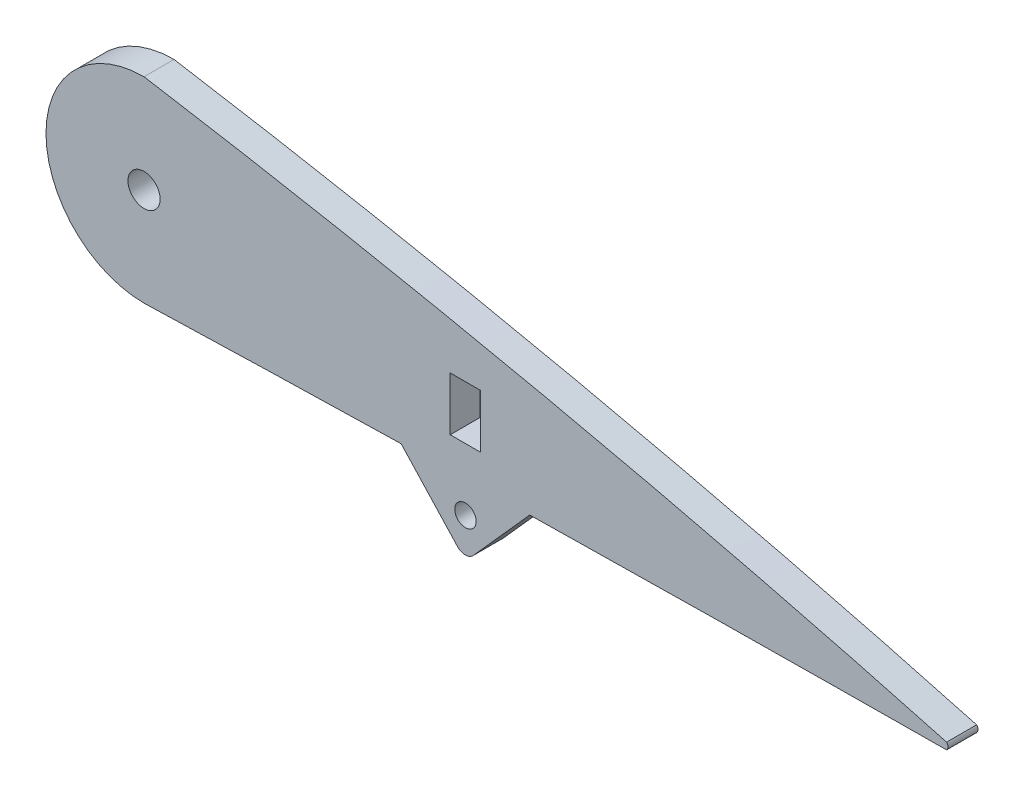
ISO-10303-21;
HEADER;
FILE_DESCRIPTION(('STEP AP214'),'2;1');
FILE_NAME('part.step','',(''),(''),'','','');
FILE_SCHEMA(('AUTOMOTIVE_DESIGN { 1 0 10303 214 1 1 1 1 }'));
ENDSEC;
DATA;
#1=APPLICATION_CONTEXT('core data for automotive mechanical design processes');
#2=APPLICATION_PROTOCOL_DEFINITION('international standard','automotive_design',2000,#1);
#3=PRODUCT_CONTEXT('',#1,'mechanical');
#4=PRODUCT('Part','Part','',(#3));
#5=PRODUCT_RELATED_PRODUCT_CATEGORY('part','',(#4));
#6=PRODUCT_DEFINITION_FORMATION('','',#4);
#7=PRODUCT_DEFINITION_CONTEXT('part definition',#1,'design');
#8=PRODUCT_DEFINITION('design','',#6,#7);
#9=PRODUCT_DEFINITION_SHAPE('','',#8);
#10=(LENGTH_UNIT() NAMED_UNIT(*) SI_UNIT(.MILLI.,.METRE.));
#11=(NAMED_UNIT(*) PLANE_ANGLE_UNIT() SI_UNIT($,.RADIAN.));
#12=(NAMED_UNIT(*) SI_UNIT($,.STERADIAN.) SOLID_ANGLE_UNIT());
#13=UNCERTAINTY_MEASURE_WITH_UNIT(LENGTH_MEASURE(1.E-05),#10,'distance_accuracy_value','');
#14=(GEOMETRIC_REPRESENTATION_CONTEXT(3) GLOBAL_UNCERTAINTY_ASSIGNED_CONTEXT((#13)) GLOBAL_UNIT_ASSIGNED_CONTEXT((#10,
#11,#12)) REPRESENTATION_CONTEXT('',''));
#15=CARTESIAN_POINT('',(0.,0.,0.));
#16=DIRECTION('',(0.,0.,1.));
#17=DIRECTION('',(1.,0.,0.));
#18=AXIS2_PLACEMENT_3D('',#15,#16,#17);
#19=CARTESIAN_POINT('',(117.917146209674,-105.209522207266,1.4));
#20=DIRECTION('',(-0.746169134705342,0.665756428743337,0.));
#21=DIRECTION('',(-0.665756428743337,-0.746169134705342,0.));
#22=AXIS2_PLACEMENT_3D('',#19,#20,#21);
#23=PLANE('',#22);
#24=DIRECTION('',(0.665756428743337,0.746169134705342,0.));
#25=VECTOR('',#24,1.);
#26=CARTESIAN_POINT('',(117.917146209674,-105.209522207266,-1.4));
#27=LINE('',#26,#25);
#28=CARTESIAN_POINT('',(205.824005664754,-6.68492308612301,-1.4));
#29=VERTEX_POINT('',#28);
#30=CARTESIAN_POINT('',(211.091334090503,-0.781385810383423,-1.4));
#31=VERTEX_POINT('',#30);
#32=EDGE_CURVE('E197',#29,#31,#27,.T.);
#33=ORIENTED_EDGE('',*,*,#32,.T.);
#34=DIRECTION('',(0.,0.,-1.));
#35=VECTOR('',#34,1.);
#36=CARTESIAN_POINT('',(211.091334090503,-0.781385810383423,1.4));
#37=LINE('',#36,#35);
#38=CARTESIAN_POINT('',(211.091334090503,-0.781385810383423,1.4));
#39=VERTEX_POINT('',#38);
#40=EDGE_CURVE('E11',#39,#31,#37,.T.);
#41=ORIENTED_EDGE('',*,*,#40,.F.);
#42=DIRECTION('',(0.665756428743337,0.746169134705342,0.));
#43=VECTOR('',#42,1.);
#44=CARTESIAN_POINT('',(117.917146209674,-105.209522207266,1.4));
#45=LINE('',#44,#43);
#46=CARTESIAN_POINT('',(205.824005664754,-6.68492308612301,1.4));
#47=VERTEX_POINT('',#46);
#48=EDGE_CURVE('E349',#47,#39,#45,.T.);
#49=ORIENTED_EDGE('',*,*,#48,.F.);
#50=DIRECTION('',(0.,0.,-1.));
#51=VECTOR('',#50,1.);
#52=CARTESIAN_POINT('',(205.824005664754,-6.68492308612301,1.4));
#53=LINE('',#52,#51);
#54=EDGE_CURVE('E239',#47,#29,#53,.T.);
#55=ORIENTED_EDGE('',*,*,#54,.T.);
#56=EDGE_LOOP('',(#33,#41,#49,#55));
#57=FACE_BOUND('',#56,.T.);
#58=ADVANCED_FACE('F41',(#57),#23,.F.);
#59=CARTESIAN_POINT('',(211.091334090503,-0.781385810383404,1.4));
#60=CARTESIAN_POINT('',(215.029550731743,-0.710611929762395,1.4));
#61=CARTESIAN_POINT('',(221.226120503685,-0.611852577213931,1.4));
#62=CARTESIAN_POINT('',(229.61763017219,-0.502926180050159,1.4));
#63=CARTESIAN_POINT('',(236.087353853958,-0.43151419174541,1.4));
#64=CARTESIAN_POINT('',(241.980776912645,-0.37652046147154,1.4));
#65=CARTESIAN_POINT('',(246.558970010783,-0.339535885925244,1.4));
#66=CARTESIAN_POINT('',(249.120490964528,-0.321271242457111,1.4));
#67=CARTESIAN_POINT('',(250.,-0.315,1.4));
#68=B_SPLINE_CURVE_WITH_KNOTS('',3,(#59,#60,#61,#62,#63,#64,#65,#66,#67),.UNSPECIFIED.,.F.,.F.,
(4,1,1,1,1,1,4),(0.846478182076588,0.893099151655267,0.919831064622048,0.945809917390178,
0.96968060086528,0.989589706283647,1.),.UNSPECIFIED.);
#69=DIRECTION('',(0.,0.,-1.));
#70=VECTOR('',#69,1.);
#71=SURFACE_OF_LINEAR_EXTRUSION('',#68,#70);
#72=CARTESIAN_POINT('',(211.091334090503,-0.781385810383404,-1.4));
#73=CARTESIAN_POINT('',(215.029550731743,-0.710611929762395,-1.4));
#74=CARTESIAN_POINT('',(221.226120503685,-0.611852577213931,-1.4));
#75=CARTESIAN_POINT('',(229.61763017219,-0.502926180050159,-1.4));
#76=CARTESIAN_POINT('',(236.087353853958,-0.43151419174541,-1.4));
#77=CARTESIAN_POINT('',(241.980776912645,-0.37652046147154,-1.4));
#78=CARTESIAN_POINT('',(246.558970010783,-0.339535885925244,-1.4));
#79=CARTESIAN_POINT('',(249.120490964528,-0.321271242457111,-1.4));
#80=CARTESIAN_POINT('',(250.,-0.315,-1.4));
#81=B_SPLINE_CURVE_WITH_KNOTS('',3,(#72,#73,#74,#75,#76,#77,#78,#79,#80),.UNSPECIFIED.,.F.,.F.,
(4,1,1,1,1,1,4),(0.846478182076588,0.893099151655267,0.919831064622048,0.945809917390178,
0.96968060086528,0.989589706283647,1.),.UNSPECIFIED.);
#82=CARTESIAN_POINT('',(250.,-0.315,-1.4));
#83=VERTEX_POINT('',#82);
#84=EDGE_CURVE('E201',#31,#83,#81,.T.);
#85=ORIENTED_EDGE('',*,*,#84,.T.);
#86=DIRECTION('',(0.,0.,-1.));
#87=VECTOR('',#86,1.);
#88=CARTESIAN_POINT('',(250.,-0.315,1.4));
#89=LINE('',#88,#87);
#90=CARTESIAN_POINT('',(250.,-0.315,1.4));
#91=VERTEX_POINT('',#90);
#92=EDGE_CURVE('E52',#91,#83,#89,.T.);
#93=ORIENTED_EDGE('',*,*,#92,.F.);
#94=EDGE_CURVE('E351',#39,#91,#68,.T.);
#95=ORIENTED_EDGE('',*,*,#94,.F.);
#96=ORIENTED_EDGE('',*,*,#40,.T.);
#97=EDGE_LOOP('',(#85,#93,#95,#96));
#98=FACE_BOUND('',#97,.T.);
#99=ADVANCED_FACE('F292',(#98),#71,.F.);
#100=CARTESIAN_POINT('',(249.685,0.,1.4));
#101=DIRECTION('',(0.,0.,-1.));
#102=DIRECTION('',(-1.,0.,0.));
#103=AXIS2_PLACEMENT_3D('',#100,#101,#102);
#104=CYLINDRICAL_SURFACE('',#103,0.445477272147512);
#105=CARTESIAN_POINT('',(249.685,0.,-1.4));
#106=DIRECTION('',(0.,0.,1.));
#107=DIRECTION('',(1.,0.,0.));
#108=AXIS2_PLACEMENT_3D('',#105,#106,#107);
#109=CIRCLE('',#108,0.445477272147512);
#110=CARTESIAN_POINT('',(250.,0.315,-1.4));
#111=VERTEX_POINT('',#110);
#112=EDGE_CURVE('E207',#111,#83,#109,.F.);
#113=ORIENTED_EDGE('',*,*,#112,.F.);
#114=DIRECTION('',(0.,0.,-1.));
#115=VECTOR('',#114,1.);
#116=CARTESIAN_POINT('',(250.,0.315,1.4));
#117=LINE('',#116,#115);
#118=CARTESIAN_POINT('',(250.,0.315,1.4));
#119=VERTEX_POINT('',#118);
#120=EDGE_CURVE('E249',#119,#111,#117,.T.);
#121=ORIENTED_EDGE('',*,*,#120,.F.);
#122=CARTESIAN_POINT('',(249.685,0.,1.4));
#123=DIRECTION('',(0.,0.,1.));
#124=DIRECTION('',(1.,0.,0.));
#125=AXIS2_PLACEMENT_3D('',#122,#123,#124);
#126=CIRCLE('',#125,0.445477272147512);
#127=EDGE_CURVE('E337',#119,#91,#126,.F.);
#128=ORIENTED_EDGE('',*,*,#127,.T.);
#129=ORIENTED_EDGE('',*,*,#92,.T.);
#130=EDGE_LOOP('',(#113,#121,#128,#129));
#131=FACE_BOUND('',#130,.T.);
#132=ADVANCED_FACE('F298',(#131),#104,.T.);
#133=CARTESIAN_POINT('',(250.,0.315,1.4));
#134=CARTESIAN_POINT('',(249.1556677398,0.545019817836279,1.4));
#135=CARTESIAN_POINT('',(246.72017569763,1.20851624251313,1.4));
#136=CARTESIAN_POINT('',(242.39133208333,2.35833905261626,1.4));
#137=CARTESIAN_POINT('',(236.8497612043,3.78762536446423,1.4));
#138=CARTESIAN_POINT('',(230.779918279366,5.29800883725429,1.4));
#139=CARTESIAN_POINT('',(224.455917947462,6.81286602762795,1.4));
#140=CARTESIAN_POINT('',(218.030543495663,8.2916106324586,1.4));
#141=CARTESIAN_POINT('',(211.562405044606,9.71973505661334,1.4));
#142=CARTESIAN_POINT('',(205.072411508973,11.0923749324442,1.4));
#143=CARTESIAN_POINT('',(198.567970912658,12.4078507263971,1.4));
#144=CARTESIAN_POINT('',(192.05236991352,13.6652979238497,1.4));
#145=CARTESIAN_POINT('',(185.527619972818,14.8640933031022,1.4));
#146=CARTESIAN_POINT('',(178.995338991115,16.0034047787228,1.4));
#147=CARTESIAN_POINT('',(172.457064741278,17.0823881152075,1.4));
#148=CARTESIAN_POINT('',(165.914317094847,18.0998278411168,1.4));
#149=CARTESIAN_POINT('',(159.368680729007,19.0545018148018,1.4));
#150=CARTESIAN_POINT('',(152.821805127969,19.9448856028229,1.4));
#151=CARTESIAN_POINT('',(146.275439401362,20.76928218283,1.4));
#152=CARTESIAN_POINT('',(139.731359791294,21.5256761133202,1.4));
#153=CARTESIAN_POINT('',(133.191836730309,22.2120042488889,1.4));
#154=CARTESIAN_POINT('',(126.658683026114,22.8257214286805,1.4));
#155=CARTESIAN_POINT('',(120.136770918309,23.363973266088,1.4));
#156=CARTESIAN_POINT('',(113.628567140501,23.8246773240715,1.4));
#157=CARTESIAN_POINT('',(107.152732037453,24.2002425936989,1.4));
#158=CARTESIAN_POINT('',(100.741095692949,24.4983995100481,1.4));
#159=CARTESIAN_POINT('',(94.4117527148801,24.6866497684384,1.4));
#160=CARTESIAN_POINT('',(88.1559179929208,24.7400956502598,1.4));
#161=CARTESIAN_POINT('',(81.9490430552625,24.658849143563,1.4));
#162=CARTESIAN_POINT('',(75.7805205915729,24.4410138083138,1.4));
#163=CARTESIAN_POINT('',(69.653692942001,24.0818848206021,1.4));
#164=CARTESIAN_POINT('',(63.5754105017725,23.5780063609574,1.4));
#165=CARTESIAN_POINT('',(57.5551895509689,22.9249466580897,1.4));
#166=CARTESIAN_POINT('',(51.6057626883655,22.1190655216041,1.4));
#167=CARTESIAN_POINT('',(45.7444003114454,21.1565644320825,1.4));
#168=CARTESIAN_POINT('',(39.9958575941734,20.035371389506,1.4));
#169=CARTESIAN_POINT('',(34.397919842374,18.756316234168,1.4));
#170=CARTESIAN_POINT('',(29.0103821035244,17.327615607561,1.4));
#171=CARTESIAN_POINT('',(23.9257984082512,15.7718649214876,1.4));
#172=CARTESIAN_POINT('',(19.2706788398757,14.1342694339559,1.4));
#173=CARTESIAN_POINT('',(15.1790983912921,12.4833354375465,1.4));
#174=CARTESIAN_POINT('',(11.7404757900967,10.8956109948061,1.4));
#175=CARTESIAN_POINT('',(8.95937186897629,9.42957736532332,1.4));
#176=CARTESIAN_POINT('',(6.76089118010329,8.10860319940964,1.4));
#177=CARTESIAN_POINT('',(5.03370974806799,6.92463805475642,1.4));
#178=CARTESIAN_POINT('',(3.67169493343308,5.85422966432144,1.4));
#179=CARTESIAN_POINT('',(2.59210112319415,4.87130536863603,1.4));
#180=CARTESIAN_POINT('',(1.73817566850273,3.95259574329487,1.4));
#181=CARTESIAN_POINT('',(1.06987082981603,3.08094637334676,1.4));
#182=CARTESIAN_POINT('',(0.571645410381898,2.24162210227498,1.4));
#183=CARTESIAN_POINT('',(0.215773898828885,1.43078539700941,1.4));
#184=CARTESIAN_POINT('',(0.102255581551055,0.88324169451159,1.4));
#185=CARTESIAN_POINT('',(0.047975,0.621425,1.4));
#186=B_SPLINE_CURVE_WITH_KNOTS('',3,(#133,#134,#135,#136,#137,#138,#139,#140,#141,#142,#143,
#144,#145,#146,#147,#148,#149,#150,#151,#152,#153,#154,#155,#156,#157,#158,#159,#160,#161,#162,
#163,#164,#165,#166,#167,#168,#169,#170,#171,#172,#173,#174,#175,#176,#177,#178,#179,#180,#181,
#182,#183,#184,#185),.UNSPECIFIED.,.F.,.F.,(4,1,1,1,1,1,1,1,1,1,1,1,1,1,1,1,1,1,1,1,1,1,1,1,1,1,
1,1,1,1,1,1,1,1,1,1,1,1,1,1,1,1,1,1,1,1,1,1,1,1,4),(0.,0.0101621996718152,0.029313053164405,
0.0520116049167946,0.0766194676467142,0.101948061207292,0.127526131749972,0.153184130655642,
0.178867887696566,0.204557902716051,0.230245711588722,0.255925967287604,0.281594302232909,
0.307246419826604,0.332878041533464,0.358484538095463,0.384061185999046,0.409602822472883,
0.435103874040524,0.460559416336008,0.485959195382529,0.511303069995141,0.53655151535457,
0.561723365940153,0.586628866723787,0.611085431247163,0.63525120042125,0.659272175841394,
0.683163753229342,0.706922144180534,0.730535909866309,0.753983199646257,0.777234690063445,
0.800246382303428,0.822950708941546,0.845237155368769,0.866915895838024,0.887662334604257,
0.906968280539555,0.924203157053238,0.938878974509372,0.95093161065299,0.960693484285195,
0.968646729467272,0.975232933115936,0.980794743901537,0.985583761312909,0.989781538836832,
0.99352131251264,0.996902112954681,1.),.UNSPECIFIED.);
#187=DIRECTION('',(0.,0.,-1.));
#188=VECTOR('',#187,1.);
#189=SURFACE_OF_LINEAR_EXTRUSION('',#186,#188);
#190=CARTESIAN_POINT('',(250.,0.315,-1.4));
#191=CARTESIAN_POINT('',(249.1556677398,0.545019817836279,-1.4));
#192=CARTESIAN_POINT('',(246.72017569763,1.20851624251313,-1.4));
#193=CARTESIAN_POINT('',(242.39133208333,2.35833905261626,-1.4));
#194=CARTESIAN_POINT('',(236.8497612043,3.78762536446423,-1.4));
#195=CARTESIAN_POINT('',(230.779918279366,5.29800883725429,-1.4));
#196=CARTESIAN_POINT('',(224.455917947462,6.81286602762795,-1.4));
#197=CARTESIAN_POINT('',(218.030543495663,8.2916106324586,-1.4));
#198=CARTESIAN_POINT('',(211.562405044606,9.71973505661334,-1.4));
#199=CARTESIAN_POINT('',(205.072411508973,11.0923749324442,-1.4));
#200=CARTESIAN_POINT('',(198.567970912658,12.4078507263971,-1.4));
#201=CARTESIAN_POINT('',(192.05236991352,13.6652979238497,-1.4));
#202=CARTESIAN_POINT('',(185.527619972818,14.8640933031022,-1.4));
#203=CARTESIAN_POINT('',(178.995338991115,16.0034047787228,-1.4));
#204=CARTESIAN_POINT('',(172.457064741278,17.0823881152075,-1.4));
#205=CARTESIAN_POINT('',(165.914317094847,18.0998278411168,-1.4));
#206=CARTESIAN_POINT('',(159.368680729007,19.0545018148018,-1.4));
#207=CARTESIAN_POINT('',(152.821805127969,19.9448856028229,-1.4));
#208=CARTESIAN_POINT('',(146.275439401362,20.76928218283,-1.4));
#209=CARTESIAN_POINT('',(139.731359791294,21.5256761133202,-1.4));
#210=CARTESIAN_POINT('',(133.191836730309,22.2120042488889,-1.4));
#211=CARTESIAN_POINT('',(126.658683026114,22.8257214286805,-1.4));
#212=CARTESIAN_POINT('',(120.136770918309,23.363973266088,-1.4));
#213=CARTESIAN_POINT('',(113.628567140501,23.8246773240715,-1.4));
#214=CARTESIAN_POINT('',(107.152732037453,24.2002425936989,-1.4));
#215=CARTESIAN_POINT('',(100.741095692949,24.4983995100481,-1.4));
#216=CARTESIAN_POINT('',(94.4117527148801,24.6866497684384,-1.4));
#217=CARTESIAN_POINT('',(88.1559179929208,24.7400956502598,-1.4));
#218=CARTESIAN_POINT('',(81.9490430552625,24.658849143563,-1.4));
#219=CARTESIAN_POINT('',(75.7805205915729,24.4410138083138,-1.4));
#220=CARTESIAN_POINT('',(69.653692942001,24.0818848206021,-1.4));
#221=CARTESIAN_POINT('',(63.5754105017725,23.5780063609574,-1.4));
#222=CARTESIAN_POINT('',(57.5551895509689,22.9249466580897,-1.4));
#223=CARTESIAN_POINT('',(51.6057626883655,22.1190655216041,-1.4));
#224=CARTESIAN_POINT('',(45.7444003114454,21.1565644320825,-1.4));
#225=CARTESIAN_POINT('',(39.9958575941734,20.035371389506,-1.4));
#226=CARTESIAN_POINT('',(34.397919842374,18.756316234168,-1.4));
#227=CARTESIAN_POINT('',(29.0103821035244,17.327615607561,-1.4));
#228=CARTESIAN_POINT('',(23.9257984082512,15.7718649214876,-1.4));
#229=CARTESIAN_POINT('',(19.2706788398757,14.1342694339559,-1.4));
#230=CARTESIAN_POINT('',(15.1790983912921,12.4833354375465,-1.4));
#231=CARTESIAN_POINT('',(11.7404757900967,10.8956109948061,-1.4));
#232=CARTESIAN_POINT('',(8.95937186897629,9.42957736532332,-1.4));
#233=CARTESIAN_POINT('',(6.76089118010329,8.10860319940964,-1.4));
#234=CARTESIAN_POINT('',(5.03370974806799,6.92463805475642,-1.4));
#235=CARTESIAN_POINT('',(3.67169493343308,5.85422966432144,-1.4));
#236=CARTESIAN_POINT('',(2.59210112319415,4.87130536863603,-1.4));
#237=CARTESIAN_POINT('',(1.73817566850273,3.95259574329487,-1.4));
#238=CARTESIAN_POINT('',(1.06987082981603,3.08094637334676,-1.4));
#239=CARTESIAN_POINT('',(0.571645410381898,2.24162210227498,-1.4));
#240=CARTESIAN_POINT('',(0.215773898828885,1.43078539700941,-1.4));
#241=CARTESIAN_POINT('',(0.102255581551055,0.88324169451159,-1.4));
#242=CARTESIAN_POINT('',(0.047975,0.621425,-1.4));
#243=B_SPLINE_CURVE_WITH_KNOTS('',3,(#190,#191,#192,#193,#194,#195,#196,#197,#198,#199,#200,
#201,#202,#203,#204,#205,#206,#207,#208,#209,#210,#211,#212,#213,#214,#215,#216,#217,#218,#219,
#220,#221,#222,#223,#224,#225,#226,#227,#228,#229,#230,#231,#232,#233,#234,#235,#236,#237,#238,
#239,#240,#241,#242),.UNSPECIFIED.,.F.,.F.,(4,1,1,1,1,1,1,1,1,1,1,1,1,1,1,1,1,1,1,1,1,1,1,1,1,1,
1,1,1,1,1,1,1,1,1,1,1,1,1,1,1,1,1,1,1,1,1,1,1,1,4),(0.,0.0101621996718152,0.029313053164405,
0.0520116049167946,0.0766194676467142,0.101948061207292,0.127526131749972,0.153184130655642,
0.178867887696566,0.204557902716051,0.230245711588722,0.255925967287604,0.281594302232909,
0.307246419826604,0.332878041533464,0.358484538095463,0.384061185999046,0.409602822472883,
0.435103874040524,0.460559416336008,0.485959195382529,0.511303069995141,0.53655151535457,
0.561723365940153,0.586628866723787,0.611085431247163,0.63525120042125,0.659272175841394,
0.683163753229342,0.706922144180534,0.730535909866309,0.753983199646257,0.777234690063445,
0.800246382303428,0.822950708941546,0.845237155368769,0.866915895838024,0.887662334604257,
0.906968280539555,0.924203157053238,0.938878974509372,0.95093161065299,0.960693484285195,
0.968646729467272,0.975232933115936,0.980794743901537,0.985583761312909,0.989781538836832,
0.99352131251264,0.996902112954681,1.),.UNSPECIFIED.);
#244=CARTESIAN_POINT('',(175.091334090503,16.6447875148628,-1.4));
#245=VERTEX_POINT('',#244);
#246=EDGE_CURVE('E214',#111,#245,#243,.T.);
#247=ORIENTED_EDGE('',*,*,#246,.T.);
#248=DIRECTION('',(0.,0.,-1.));
#249=VECTOR('',#248,1.);
#250=CARTESIAN_POINT('',(175.091334090503,16.6447875148628,1.4));
#251=LINE('',#250,#249);
#252=CARTESIAN_POINT('',(175.091334090503,16.6447875148628,1.4));
#253=VERTEX_POINT('',#252);
#254=EDGE_CURVE('E246',#253,#245,#251,.T.);
#255=ORIENTED_EDGE('',*,*,#254,.F.);
#256=EDGE_CURVE('E331',#119,#253,#186,.T.);
#257=ORIENTED_EDGE('',*,*,#256,.F.);
#258=ORIENTED_EDGE('',*,*,#120,.T.);
#259=EDGE_LOOP('',(#247,#255,#257,#258));
#260=FACE_BOUND('',#259,.T.);
#261=ADVANCED_FACE('F326',(#260),#189,.F.);
#262=CARTESIAN_POINT('',(175.091334090503,7.49391035659057,1.4));
#263=DIRECTION('',(0.,0.,-1.));
#264=DIRECTION('',(-1.,0.,0.));
#265=AXIS2_PLACEMENT_3D('',#262,#263,#264);
#266=CYLINDRICAL_SURFACE('',#265,9.15087715827226);
#267=CARTESIAN_POINT('',(175.091334090503,7.49391035659057,-1.4));
#268=DIRECTION('',(0.,0.,1.));
#269=DIRECTION('',(1.,0.,0.));
#270=AXIS2_PLACEMENT_3D('',#267,#268,#269);
#271=CIRCLE('',#270,9.15087715827226);
#272=CARTESIAN_POINT('',(175.091334090503,-1.65696680168169,-1.4));
#273=VERTEX_POINT('',#272);
#274=EDGE_CURVE('E220',#273,#245,#271,.F.);
#275=ORIENTED_EDGE('',*,*,#274,.F.);
#276=DIRECTION('',(0.,0.,-1.));
#277=VECTOR('',#276,1.);
#278=CARTESIAN_POINT('',(175.091334090503,-1.65696680168169,1.4));
#279=LINE('',#278,#277);
#280=CARTESIAN_POINT('',(175.091334090503,-1.65696680168169,1.4));
#281=VERTEX_POINT('',#280);
#282=EDGE_CURVE('E159',#281,#273,#279,.T.);
#283=ORIENTED_EDGE('',*,*,#282,.F.);
#284=CARTESIAN_POINT('',(175.091334090503,7.49391035659057,1.4));
#285=DIRECTION('',(0.,0.,1.));
#286=DIRECTION('',(1.,0.,0.));
#287=AXIS2_PLACEMENT_3D('',#284,#285,#286);
#288=CIRCLE('',#287,9.15087715827226);
#289=EDGE_CURVE('E150',#281,#253,#288,.F.);
#290=ORIENTED_EDGE('',*,*,#289,.T.);
#291=ORIENTED_EDGE('',*,*,#254,.T.);
#292=EDGE_LOOP('',(#275,#283,#290,#291));
#293=FACE_BOUND('',#292,.T.);
#294=ADVANCED_FACE('F323',(#293),#266,.T.);
#295=CARTESIAN_POINT('',(0.0479750000000421,0.621425,1.4));
#296=CARTESIAN_POINT('',(0.022713820327741,0.373490085622781,1.4));
#297=CARTESIAN_POINT('',(-0.0278207890064172,-0.122499975050795,1.4));
#298=CARTESIAN_POINT('',(0.0779912124031796,-0.88443459016519,1.4));
#299=CARTESIAN_POINT('',(0.349695650480458,-1.63883807038265,1.4));
#300=CARTESIAN_POINT('',(0.814331135147463,-2.36506892355342,1.4));
#301=CARTESIAN_POINT('',(1.4634807804219,-3.03927524464575,1.4));
#302=CARTESIAN_POINT('',(2.29097301669102,-3.66099946963281,1.4));
#303=CARTESIAN_POINT('',(3.30592875031195,-4.2357796210425,1.4));
#304=CARTESIAN_POINT('',(4.53525561919671,-4.77367414359715,1.4));
#305=CARTESIAN_POINT('',(6.02974568831346,-5.28219216458874,1.4));
#306=CARTESIAN_POINT('',(7.86898121529209,-5.76531667645051,1.4));
#307=CARTESIAN_POINT('',(10.1688313918681,-6.22171659287992,1.4));
#308=CARTESIAN_POINT('',(13.0754381889024,-6.63961873115047,1.4));
#309=CARTESIAN_POINT('',(16.7281153626735,-6.99295673763017,1.4));
#310=CARTESIAN_POINT('',(21.1899520960732,-7.24734514464806,1.4));
#311=CARTESIAN_POINT('',(26.3999844156187,-7.37663884891169,1.4));
#312=CARTESIAN_POINT('',(32.1973985639445,-7.37625691302859,1.4));
#313=CARTESIAN_POINT('',(38.3978067590692,-7.26143657975343,1.4));
#314=CARTESIAN_POINT('',(44.8576217679812,-7.05664135811482,1.4));
#315=CARTESIAN_POINT('',(51.4865430961522,-6.78645353185094,1.4));
#316=CARTESIAN_POINT('',(58.2309809321379,-6.472324586792,1.4));
#317=CARTESIAN_POINT('',(65.0520946060157,-6.13285226452229,1.4));
#318=CARTESIAN_POINT('',(71.9107727092363,-5.78400517673341,1.4));
#319=CARTESIAN_POINT('',(78.771375576202,-5.4396804536293,1.4));
#320=CARTESIAN_POINT('',(85.6104986098069,-5.11095125256302,1.4));
#321=CARTESIAN_POINT('',(92.4321075899319,-4.80495332572016,1.4));
#322=CARTESIAN_POINT('',(99.2550311901161,-4.53198165482286,1.4));
#323=CARTESIAN_POINT('',(106.097378404908,-4.27827467093654,1.4));
#324=CARTESIAN_POINT('',(112.969211680251,-4.00308992591576,1.4));
#325=CARTESIAN_POINT('',(119.864404254546,-3.7231761842266,1.4));
#326=CARTESIAN_POINT('',(126.77386047349,-3.44006729637194,1.4));
#327=CARTESIAN_POINT('',(133.681563213166,-3.15869560039856,1.4));
#328=CARTESIAN_POINT('',(140.581870407103,-2.88238072038557,1.4));
#329=CARTESIAN_POINT('',(147.472013761628,-2.61392295823053,1.4));
#330=CARTESIAN_POINT('',(154.352602410647,-2.35562641478931,1.4));
#331=CARTESIAN_POINT('',(161.225044134143,-2.10936992101264,1.4));
#332=CARTESIAN_POINT('',(168.090869746122,-1.87663407423007,1.4));
#333=CARTESIAN_POINT('',(174.951578521954,-1.65864310394776,1.4));
#334=CARTESIAN_POINT('',(181.808595965616,-1.45637812296637,1.4));
#335=CARTESIAN_POINT('',(188.663234462377,-1.27038337713602,1.4));
#336=CARTESIAN_POINT('',(194.423908611312,-1.12810208165502,1.4));
#337=CARTESIAN_POINT('',(197.899847219277,-1.04871934980089,1.4));
#338=CARTESIAN_POINT('',(199.091334090503,-1.0222676899704,1.4));
#339=B_SPLINE_CURVE_WITH_KNOTS('',3,(#295,#296,#297,#298,#299,#300,#301,#302,#303,#304,#305,
#306,#307,#308,#309,#310,#311,#312,#313,#314,#315,#316,#317,#318,#319,#320,#321,#322,#323,#324,
#325,#326,#327,#328,#329,#330,#331,#332,#333,#334,#335,#336,#337,#338),.UNSPECIFIED.,.F.,.F.,(4,
1,1,1,1,1,1,1,1,1,1,1,1,1,1,1,1,1,1,1,1,1,1,1,1,1,1,1,1,1,1,1,1,1,1,1,1,1,1,1,1,4),(0.,
0.00294144629716841,0.00588431899986843,0.00901612990907169,0.0123645467308032,
0.0160079338878462,0.0200368451305784,0.0245737277973679,0.029783834741521,0.0358970100073663,
0.043240439578336,0.0522759653413005,0.0636345893302709,0.0779831757705632,0.0956981612833506,
0.116520086015495,0.139660730330278,0.164312170171254,0.189918890388145,0.216157201054431,
0.242837761985605,0.269833582781319,0.296993021546457,0.324123271890544,0.351139106824528,
0.378035508721976,0.404946015910257,0.431960836658272,0.459078394602815,0.486347400324305,
0.513640830241323,0.540928594677757,0.568176028038828,0.595379568955062,0.622543444942076,
0.6496732603013,0.676775201241309,0.70385522836994,0.730918774891245,0.757971338224895,
0.785017763038357,0.799123890261102),.UNSPECIFIED.);
#340=DIRECTION('',(0.,0.,-1.));
#341=VECTOR('',#340,1.);
#342=SURFACE_OF_LINEAR_EXTRUSION('',#339,#341);
#343=CARTESIAN_POINT('',(0.0479750000000421,0.621425,-1.4));
#344=CARTESIAN_POINT('',(0.022713820327741,0.373490085622781,-1.4));
#345=CARTESIAN_POINT('',(-0.0278207890064172,-0.122499975050795,-1.4));
#346=CARTESIAN_POINT('',(0.0779912124031796,-0.88443459016519,-1.4));
#347=CARTESIAN_POINT('',(0.349695650480458,-1.63883807038265,-1.4));
#348=CARTESIAN_POINT('',(0.814331135147463,-2.36506892355342,-1.4));
#349=CARTESIAN_POINT('',(1.4634807804219,-3.03927524464575,-1.4));
#350=CARTESIAN_POINT('',(2.29097301669102,-3.66099946963281,-1.4));
#351=CARTESIAN_POINT('',(3.30592875031195,-4.2357796210425,-1.4));
#352=CARTESIAN_POINT('',(4.53525561919671,-4.77367414359715,-1.4));
#353=CARTESIAN_POINT('',(6.02974568831346,-5.28219216458874,-1.4));
#354=CARTESIAN_POINT('',(7.86898121529209,-5.76531667645051,-1.4));
#355=CARTESIAN_POINT('',(10.1688313918681,-6.22171659287992,-1.4));
#356=CARTESIAN_POINT('',(13.0754381889024,-6.63961873115047,-1.4));
#357=CARTESIAN_POINT('',(16.7281153626735,-6.99295673763017,-1.4));
#358=CARTESIAN_POINT('',(21.1899520960732,-7.24734514464806,-1.4));
#359=CARTESIAN_POINT('',(26.3999844156187,-7.37663884891169,-1.4));
#360=CARTESIAN_POINT('',(32.1973985639445,-7.37625691302859,-1.4));
#361=CARTESIAN_POINT('',(38.3978067590692,-7.26143657975343,-1.4));
#362=CARTESIAN_POINT('',(44.8576217679812,-7.05664135811482,-1.4));
#363=CARTESIAN_POINT('',(51.4865430961522,-6.78645353185094,-1.4));
#364=CARTESIAN_POINT('',(58.2309809321379,-6.472324586792,-1.4));
#365=CARTESIAN_POINT('',(65.0520946060157,-6.13285226452229,-1.4));
#366=CARTESIAN_POINT('',(71.9107727092363,-5.78400517673341,-1.4));
#367=CARTESIAN_POINT('',(78.771375576202,-5.4396804536293,-1.4));
#368=CARTESIAN_POINT('',(85.6104986098069,-5.11095125256302,-1.4));
#369=CARTESIAN_POINT('',(92.4321075899319,-4.80495332572016,-1.4));
#370=CARTESIAN_POINT('',(99.2550311901161,-4.53198165482286,-1.4));
#371=CARTESIAN_POINT('',(106.097378404908,-4.27827467093654,-1.4));
#372=CARTESIAN_POINT('',(112.969211680251,-4.00308992591576,-1.4));
#373=CARTESIAN_POINT('',(119.864404254546,-3.7231761842266,-1.4));
#374=CARTESIAN_POINT('',(126.77386047349,-3.44006729637194,-1.4));
#375=CARTESIAN_POINT('',(133.681563213166,-3.15869560039856,-1.4));
#376=CARTESIAN_POINT('',(140.581870407103,-2.88238072038557,-1.4));
#377=CARTESIAN_POINT('',(147.472013761628,-2.61392295823053,-1.4));
#378=CARTESIAN_POINT('',(154.352602410647,-2.35562641478931,-1.4));
#379=CARTESIAN_POINT('',(161.225044134143,-2.10936992101264,-1.4));
#380=CARTESIAN_POINT('',(168.090869746122,-1.87663407423007,-1.4));
#381=CARTESIAN_POINT('',(174.951578521954,-1.65864310394776,-1.4));
#382=CARTESIAN_POINT('',(181.808595965616,-1.45637812296637,-1.4));
#383=CARTESIAN_POINT('',(188.663234462377,-1.27038337713602,-1.4));
#384=CARTESIAN_POINT('',(194.423908611312,-1.12810208165502,-1.4));
#385=CARTESIAN_POINT('',(197.899847219277,-1.04871934980089,-1.4));
#386=CARTESIAN_POINT('',(199.091334090503,-1.0222676899704,-1.4));
#387=B_SPLINE_CURVE_WITH_KNOTS('',3,(#343,#344,#345,#346,#347,#348,#349,#350,#351,#352,#353,
#354,#355,#356,#357,#358,#359,#360,#361,#362,#363,#364,#365,#366,#367,#368,#369,#370,#371,#372,
#373,#374,#375,#376,#377,#378,#379,#380,#381,#382,#383,#384,#385,#386),.UNSPECIFIED.,.F.,.F.,(4,
1,1,1,1,1,1,1,1,1,1,1,1,1,1,1,1,1,1,1,1,1,1,1,1,1,1,1,1,1,1,1,1,1,1,1,1,1,1,1,1,4),(0.,
0.00294144629716841,0.00588431899986843,0.00901612990907169,0.0123645467308032,
0.0160079338878462,0.0200368451305784,0.0245737277973679,0.029783834741521,0.0358970100073663,
0.043240439578336,0.0522759653413005,0.0636345893302709,0.0779831757705632,0.0956981612833506,
0.116520086015495,0.139660730330278,0.164312170171254,0.189918890388145,0.216157201054431,
0.242837761985605,0.269833582781319,0.296993021546457,0.324123271890544,0.351139106824528,
0.378035508721976,0.404946015910257,0.431960836658272,0.459078394602815,0.486347400324305,
0.513640830241323,0.540928594677757,0.568176028038828,0.595379568955062,0.622543444942076,
0.6496732603013,0.676775201241309,0.70385522836994,0.730918774891245,0.757971338224895,
0.785017763038357,0.799123890261102),.UNSPECIFIED.);
#388=CARTESIAN_POINT('',(199.091334090503,-1.02226768997042,-1.4));
#389=VERTEX_POINT('',#388);
#390=EDGE_CURVE('E157',#273,#389,#387,.T.);
#391=ORIENTED_EDGE('',*,*,#390,.T.);
#392=DIRECTION('',(0.,0.,-1.));
#393=VECTOR('',#392,1.);
#394=CARTESIAN_POINT('',(199.091334090503,-1.02226768997042,1.4));
#395=LINE('',#394,#393);
#396=CARTESIAN_POINT('',(199.091334090503,-1.02226768997042,1.4));
#397=VERTEX_POINT('',#396);
#398=EDGE_CURVE('E154',#397,#389,#395,.T.);
#399=ORIENTED_EDGE('',*,*,#398,.F.);
#400=EDGE_CURVE('E144',#281,#397,#339,.T.);
#401=ORIENTED_EDGE('',*,*,#400,.F.);
#402=ORIENTED_EDGE('',*,*,#282,.T.);
#403=EDGE_LOOP('',(#391,#399,#401,#402));
#404=FACE_BOUND('',#403,.T.);
#405=ADVANCED_FACE('F155',(#404),#342,.F.);
#406=CARTESIAN_POINT('',(106.740461197686,98.7755018236466,1.4));
#407=DIRECTION('',(0.733960347008436,0.679192321083842,0.));
#408=DIRECTION('',(-0.679192321083842,0.733960347008436,0.));
#409=AXIS2_PLACEMENT_3D('',#406,#407,#408);
#410=PLANE('',#409);
#411=DIRECTION('',(0.679192321083842,-0.733960347008436,0.));
#412=VECTOR('',#411,1.);
#413=CARTESIAN_POINT('',(106.740461197686,98.7755018236466,-1.4));
#414=LINE('',#413,#412);
#415=CARTESIAN_POINT('',(204.34387618304,-6.69835897846351,-1.4));
#416=VERTEX_POINT('',#415);
#417=EDGE_CURVE('E102',#389,#416,#414,.T.);
#418=ORIENTED_EDGE('',*,*,#417,.T.);
#419=DIRECTION('',(0.,0.,-1.));
#420=VECTOR('',#419,1.);
#421=CARTESIAN_POINT('',(204.34387618304,-6.69835897846351,1.4));
#422=LINE('',#421,#420);
#423=CARTESIAN_POINT('',(204.34387618304,-6.69835897846351,1.4));
#424=VERTEX_POINT('',#423);
#425=EDGE_CURVE('E160',#424,#416,#422,.T.);
#426=ORIENTED_EDGE('',*,*,#425,.F.);
#427=DIRECTION('',(0.679192321083842,-0.733960347008436,0.));
#428=VECTOR('',#427,1.);
#429=CARTESIAN_POINT('',(106.740461197686,98.7755018236466,1.4));
#430=LINE('',#429,#428);
#431=EDGE_CURVE('E148',#397,#424,#430,.T.);
#432=ORIENTED_EDGE('',*,*,#431,.F.);
#433=ORIENTED_EDGE('',*,*,#398,.T.);
#434=EDGE_LOOP('',(#418,#426,#432,#433));
#435=FACE_BOUND('',#434,.T.);
#436=ADVANCED_FACE('F162',(#435),#410,.F.);
#437=CARTESIAN_POINT('',(0.,6.99391035659057,1.4));
#438=DIRECTION('',(0.,1.,0.));
#439=DIRECTION('',(0.,0.,1.));
#440=AXIS2_PLACEMENT_3D('',#437,#438,#439);
#441=PLANE('',#440);
#442=DIRECTION('',(1.,0.,0.));
#443=VECTOR('',#442,1.);
#444=CARTESIAN_POINT('',(0.,6.99391035659057,-1.4));
#445=LINE('',#444,#443);
#446=CARTESIAN_POINT('',(203.666334090503,6.99391035659057,-1.4));
#447=VERTEX_POINT('',#446);
#448=CARTESIAN_POINT('',(206.516334090503,6.99391035659057,-1.4));
#449=VERTEX_POINT('',#448);
#450=EDGE_CURVE('E173',#447,#449,#445,.T.);
#451=ORIENTED_EDGE('',*,*,#450,.T.);
#452=DIRECTION('',(0.,0.,-1.));
#453=VECTOR('',#452,1.);
#454=CARTESIAN_POINT('',(206.516334090503,6.99391035659057,1.4));
#455=LINE('',#454,#453);
#456=CARTESIAN_POINT('',(206.516334090503,6.99391035659057,1.4));
#457=VERTEX_POINT('',#456);
#458=EDGE_CURVE('E45',#457,#449,#455,.T.);
#459=ORIENTED_EDGE('',*,*,#458,.F.);
#460=DIRECTION('',(1.,0.,0.));
#461=VECTOR('',#460,1.);
#462=CARTESIAN_POINT('',(0.,6.99391035659057,1.4));
#463=LINE('',#462,#461);
#464=CARTESIAN_POINT('',(203.666334090503,6.99391035659057,1.4));
#465=VERTEX_POINT('',#464);
#466=EDGE_CURVE('E238',#465,#457,#463,.T.);
#467=ORIENTED_EDGE('',*,*,#466,.F.);
#468=DIRECTION('',(0.,0.,-1.));
#469=VECTOR('',#468,1.);
#470=CARTESIAN_POINT('',(203.666334090503,6.99391035659057,1.4));
#471=LINE('',#470,#469);
#472=EDGE_CURVE('E166',#465,#447,#471,.T.);
#473=ORIENTED_EDGE('',*,*,#472,.T.);
#474=EDGE_LOOP('',(#451,#459,#467,#473));
#475=FACE_BOUND('',#474,.T.);
#476=ADVANCED_FACE('F43',(#475),#441,.F.);
#477=CARTESIAN_POINT('',(206.516334090503,0.,1.4));
#478=DIRECTION('',(1.,0.,0.));
#479=DIRECTION('',(0.,0.,-1.));
#480=AXIS2_PLACEMENT_3D('',#477,#478,#479);
#481=PLANE('',#480);
#482=DIRECTION('',(0.,-1.,0.));
#483=VECTOR('',#482,1.);
#484=CARTESIAN_POINT('',(206.516334090503,0.,-1.4));
#485=LINE('',#484,#483);
#486=CARTESIAN_POINT('',(206.516334090503,1.99391035659057,-1.4));
#487=VERTEX_POINT('',#486);
#488=EDGE_CURVE('E177',#449,#487,#485,.T.);
#489=ORIENTED_EDGE('',*,*,#488,.T.);
#490=DIRECTION('',(0.,0.,-1.));
#491=VECTOR('',#490,1.);
#492=CARTESIAN_POINT('',(206.516334090503,1.99391035659057,1.4));
#493=LINE('',#492,#491);
#494=CARTESIAN_POINT('',(206.516334090503,1.99391035659057,1.4));
#495=VERTEX_POINT('',#494);
#496=EDGE_CURVE('E258',#495,#487,#493,.T.);
#497=ORIENTED_EDGE('',*,*,#496,.F.);
#498=DIRECTION('',(0.,-1.,0.));
#499=VECTOR('',#498,1.);
#500=CARTESIAN_POINT('',(206.516334090503,0.,1.4));
#501=LINE('',#500,#499);
#502=EDGE_CURVE('E117',#457,#495,#501,.T.);
#503=ORIENTED_EDGE('',*,*,#502,.F.);
#504=ORIENTED_EDGE('',*,*,#458,.T.);
#505=EDGE_LOOP('',(#489,#497,#503,#504));
#506=FACE_BOUND('',#505,.T.);
#507=ADVANCED_FACE('F265',(#506),#481,.F.);
#508=CARTESIAN_POINT('',(0.,1.9939103565906,1.4));
#509=DIRECTION('',(0.,1.,0.));
#510=DIRECTION('',(-1.,0.,0.));
#511=AXIS2_PLACEMENT_3D('',#508,#509,#510);
#512=PLANE('',#511);
#513=DIRECTION('',(1.,0.,0.));
#514=VECTOR('',#513,1.);
#515=CARTESIAN_POINT('',(0.,1.9939103565906,-1.4));
#516=LINE('',#515,#514);
#517=CARTESIAN_POINT('',(203.666334090503,1.99391035659057,-1.4));
#518=VERTEX_POINT('',#517);
#519=EDGE_CURVE('E181',#518,#487,#516,.T.);
#520=ORIENTED_EDGE('',*,*,#519,.F.);
#521=DIRECTION('',(0.,0.,-1.));
#522=VECTOR('',#521,1.);
#523=CARTESIAN_POINT('',(203.666334090503,1.99391035659057,1.4));
#524=LINE('',#523,#522);
#525=CARTESIAN_POINT('',(203.666334090503,1.99391035659057,1.4));
#526=VERTEX_POINT('',#525);
#527=EDGE_CURVE('E256',#526,#518,#524,.T.);
#528=ORIENTED_EDGE('',*,*,#527,.F.);
#529=DIRECTION('',(1.,0.,0.));
#530=VECTOR('',#529,1.);
#531=CARTESIAN_POINT('',(0.,1.9939103565906,1.4));
#532=LINE('',#531,#530);
#533=EDGE_CURVE('E371',#526,#495,#532,.T.);
#534=ORIENTED_EDGE('',*,*,#533,.T.);
#535=ORIENTED_EDGE('',*,*,#496,.T.);
#536=EDGE_LOOP('',(#520,#528,#534,#535));
#537=FACE_BOUND('',#536,.T.);
#538=ADVANCED_FACE('F279',(#537),#512,.T.);
#539=CARTESIAN_POINT('',(205.091334090503,-3.80608964340943,1.4));
#540=DIRECTION('',(0.,0.,-1.));
#541=DIRECTION('',(-1.,0.,0.));
#542=AXIS2_PLACEMENT_3D('',#539,#540,#541);
#543=CYLINDRICAL_SURFACE('',#542,0.999999999999998);
#544=CARTESIAN_POINT('',(205.091334090503,-3.80608964340943,1.4));
#545=DIRECTION('',(0.,0.,1.));
#546=DIRECTION('',(1.,0.,0.));
#547=AXIS2_PLACEMENT_3D('',#544,#545,#546);
#548=CIRCLE('',#547,0.999999999999998);
#549=CARTESIAN_POINT('',(206.091334090503,-3.80608964340943,1.4));
#550=VERTEX_POINT('',#549);
#551=EDGE_CURVE('E352',#550,#550,#548,.T.);
#552=ORIENTED_EDGE('',*,*,#551,.T.);
#553=EDGE_LOOP('',(#552));
#554=FACE_BOUND('',#553,.T.);
#555=CARTESIAN_POINT('',(205.091334090503,-3.80608964340943,-1.4));
#556=DIRECTION('',(0.,0.,1.));
#557=DIRECTION('',(1.,0.,0.));
#558=AXIS2_PLACEMENT_3D('',#555,#556,#557);
#559=CIRCLE('',#558,0.999999999999998);
#560=CARTESIAN_POINT('',(206.091334090503,-3.80608964340943,-1.4));
#561=VERTEX_POINT('',#560);
#562=EDGE_CURVE('E193',#561,#561,#559,.T.);
#563=ORIENTED_EDGE('',*,*,#562,.F.);
#564=EDGE_LOOP('',(#563));
#565=FACE_BOUND('',#564,.T.);
#566=ADVANCED_FACE('F281',(#554,#565),#543,.F.);
#567=CARTESIAN_POINT('',(175.091334090503,7.49391035659057,1.4));
#568=DIRECTION('',(0.,0.,-1.));
#569=DIRECTION('',(-1.,0.,0.));
#570=AXIS2_PLACEMENT_3D('',#567,#568,#569);
#571=CYLINDRICAL_SURFACE('',#570,1.5);
#572=CARTESIAN_POINT('',(175.091334090503,7.49391035659057,1.4));
#573=DIRECTION('',(0.,0.,1.));
#574=DIRECTION('',(1.,0.,0.));
#575=AXIS2_PLACEMENT_3D('',#572,#573,#574);
#576=CIRCLE('',#575,1.5);
#577=CARTESIAN_POINT('',(176.591334090503,7.49391035659057,1.4));
#578=VERTEX_POINT('',#577);
#579=EDGE_CURVE('E357',#578,#578,#576,.T.);
#580=ORIENTED_EDGE('',*,*,#579,.T.);
#581=EDGE_LOOP('',(#580));
#582=FACE_BOUND('',#581,.T.);
#583=CARTESIAN_POINT('',(175.091334090503,7.49391035659057,-1.4));
#584=DIRECTION('',(0.,0.,1.));
#585=DIRECTION('',(1.,0.,0.));
#586=AXIS2_PLACEMENT_3D('',#583,#584,#585);
#587=CIRCLE('',#586,1.5);
#588=CARTESIAN_POINT('',(176.591334090503,7.49391035659057,-1.4));
#589=VERTEX_POINT('',#588);
#590=EDGE_CURVE('E189',#589,#589,#587,.T.);
#591=ORIENTED_EDGE('',*,*,#590,.F.);
#592=EDGE_LOOP('',(#591));
#593=FACE_BOUND('',#592,.T.);
#594=ADVANCED_FACE('F287',(#582,#593),#571,.F.);
#595=CARTESIAN_POINT('',(203.666334090503,0.,1.4));
#596=DIRECTION('',(1.,0.,0.));
#597=DIRECTION('',(0.,0.,-1.));
#598=AXIS2_PLACEMENT_3D('',#595,#596,#597);
#599=PLANE('',#598);
#600=DIRECTION('',(0.,-1.,0.));
#601=VECTOR('',#600,1.);
#602=CARTESIAN_POINT('',(203.666334090503,0.,-1.4));
#603=LINE('',#602,#601);
#604=EDGE_CURVE('E185',#447,#518,#603,.T.);
#605=ORIENTED_EDGE('',*,*,#604,.F.);
#606=ORIENTED_EDGE('',*,*,#472,.F.);
#607=DIRECTION('',(0.,-1.,0.));
#608=VECTOR('',#607,1.);
#609=CARTESIAN_POINT('',(203.666334090503,0.,1.4));
#610=LINE('',#609,#608);
#611=EDGE_CURVE('E277',#465,#526,#610,.T.);
#612=ORIENTED_EDGE('',*,*,#611,.T.);
#613=ORIENTED_EDGE('',*,*,#527,.T.);
#614=EDGE_LOOP('',(#605,#606,#612,#613));
#615=FACE_BOUND('',#614,.T.);
#616=ADVANCED_FACE('F274',(#615),#599,.T.);
#617=CARTESIAN_POINT('',(205.077836530038,-6.01916665737785,1.4));
#618=DIRECTION('',(0.,0.,-1.));
#619=DIRECTION('',(-1.,0.,0.));
#620=AXIS2_PLACEMENT_3D('',#617,#618,#619);
#621=CYLINDRICAL_SURFACE('',#620,1.00000000000129);
#622=CARTESIAN_POINT('',(205.077836530038,-6.01916665737785,-1.4));
#623=DIRECTION('',(0.,0.,1.));
#624=DIRECTION('',(1.,0.,0.));
#625=AXIS2_PLACEMENT_3D('',#622,#623,#624);
#626=CIRCLE('',#625,1.00000000000129);
#627=EDGE_CURVE('E108',#416,#29,#626,.T.);
#628=ORIENTED_EDGE('',*,*,#627,.T.);
#629=ORIENTED_EDGE('',*,*,#54,.F.);
#630=CARTESIAN_POINT('',(205.077836530038,-6.01916665737785,1.4));
#631=DIRECTION('',(0.,0.,1.));
#632=DIRECTION('',(1.,0.,0.));
#633=AXIS2_PLACEMENT_3D('',#630,#631,#632);
#634=CIRCLE('',#633,1.00000000000129);
#635=EDGE_CURVE('E61',#424,#47,#634,.T.);
#636=ORIENTED_EDGE('',*,*,#635,.F.);
#637=ORIENTED_EDGE('',*,*,#425,.T.);
#638=EDGE_LOOP('',(#628,#629,#636,#637));
#639=FACE_BOUND('',#638,.T.);
#640=ADVANCED_FACE('F307',(#639),#621,.T.);
#641=CARTESIAN_POINT('',(0.,0.,1.4));
#642=DIRECTION('',(0.,0.,1.));
#643=DIRECTION('',(1.,0.,0.));
#644=AXIS2_PLACEMENT_3D('',#641,#642,#643);
#645=PLANE('',#644);
#646=ORIENTED_EDGE('',*,*,#466,.T.);
#647=ORIENTED_EDGE('',*,*,#502,.T.);
#648=ORIENTED_EDGE('',*,*,#533,.F.);
#649=ORIENTED_EDGE('',*,*,#611,.F.);
#650=EDGE_LOOP('',(#646,#647,#648,#649));
#651=FACE_BOUND('',#650,.T.);
#652=ORIENTED_EDGE('',*,*,#579,.F.);
#653=EDGE_LOOP('',(#652));
#654=FACE_BOUND('',#653,.T.);
#655=ORIENTED_EDGE('',*,*,#551,.F.);
#656=EDGE_LOOP('',(#655));
#657=FACE_BOUND('',#656,.T.);
#658=ORIENTED_EDGE('',*,*,#48,.T.);
#659=ORIENTED_EDGE('',*,*,#94,.T.);
#660=ORIENTED_EDGE('',*,*,#127,.F.);
#661=ORIENTED_EDGE('',*,*,#256,.T.);
#662=ORIENTED_EDGE('',*,*,#289,.F.);
#663=ORIENTED_EDGE('',*,*,#400,.T.);
#664=ORIENTED_EDGE('',*,*,#431,.T.);
#665=ORIENTED_EDGE('',*,*,#635,.T.);
#666=EDGE_LOOP('',(#658,#659,#660,#661,#662,#663,#664,#665));
#667=FACE_BOUND('',#666,.T.);
#668=ADVANCED_FACE('F146',(#651,#654,#657,#667),#645,.T.);
#669=CARTESIAN_POINT('',(0.,0.,-1.4));
#670=DIRECTION('',(0.,0.,1.));
#671=DIRECTION('',(1.,0.,0.));
#672=AXIS2_PLACEMENT_3D('',#669,#670,#671);
#673=PLANE('',#672);
#674=ORIENTED_EDGE('',*,*,#450,.F.);
#675=ORIENTED_EDGE('',*,*,#604,.T.);
#676=ORIENTED_EDGE('',*,*,#519,.T.);
#677=ORIENTED_EDGE('',*,*,#488,.F.);
#678=EDGE_LOOP('',(#674,#675,#676,#677));
#679=FACE_BOUND('',#678,.T.);
#680=ORIENTED_EDGE('',*,*,#590,.T.);
#681=EDGE_LOOP('',(#680));
#682=FACE_BOUND('',#681,.T.);
#683=ORIENTED_EDGE('',*,*,#562,.T.);
#684=EDGE_LOOP('',(#683));
#685=FACE_BOUND('',#684,.T.);
#686=ORIENTED_EDGE('',*,*,#32,.F.);
#687=ORIENTED_EDGE('',*,*,#627,.F.);
#688=ORIENTED_EDGE('',*,*,#417,.F.);
#689=ORIENTED_EDGE('',*,*,#390,.F.);
#690=ORIENTED_EDGE('',*,*,#274,.T.);
#691=ORIENTED_EDGE('',*,*,#246,.F.);
#692=ORIENTED_EDGE('',*,*,#112,.T.);
#693=ORIENTED_EDGE('',*,*,#84,.F.);
#694=EDGE_LOOP('',(#686,#687,#688,#689,#690,#691,#692,#693));
#695=FACE_BOUND('',#694,.T.);
#696=ADVANCED_FACE('F271',(#679,#682,#685,#695),#673,.F.);
#697=CLOSED_SHELL('',(#58,#99,#132,#261,#294,#405,#436,#476,#507,#538,#566,#594,#616,#640,#668,#696));
#698=MANIFOLD_SOLID_BREP('B2',#697);
#699=ADVANCED_BREP_SHAPE_REPRESENTATION('',(#18,#698),#14);
#700=SHAPE_DEFINITION_REPRESENTATION(#9,#699);
ENDSEC;
END-ISO-10303-21;
